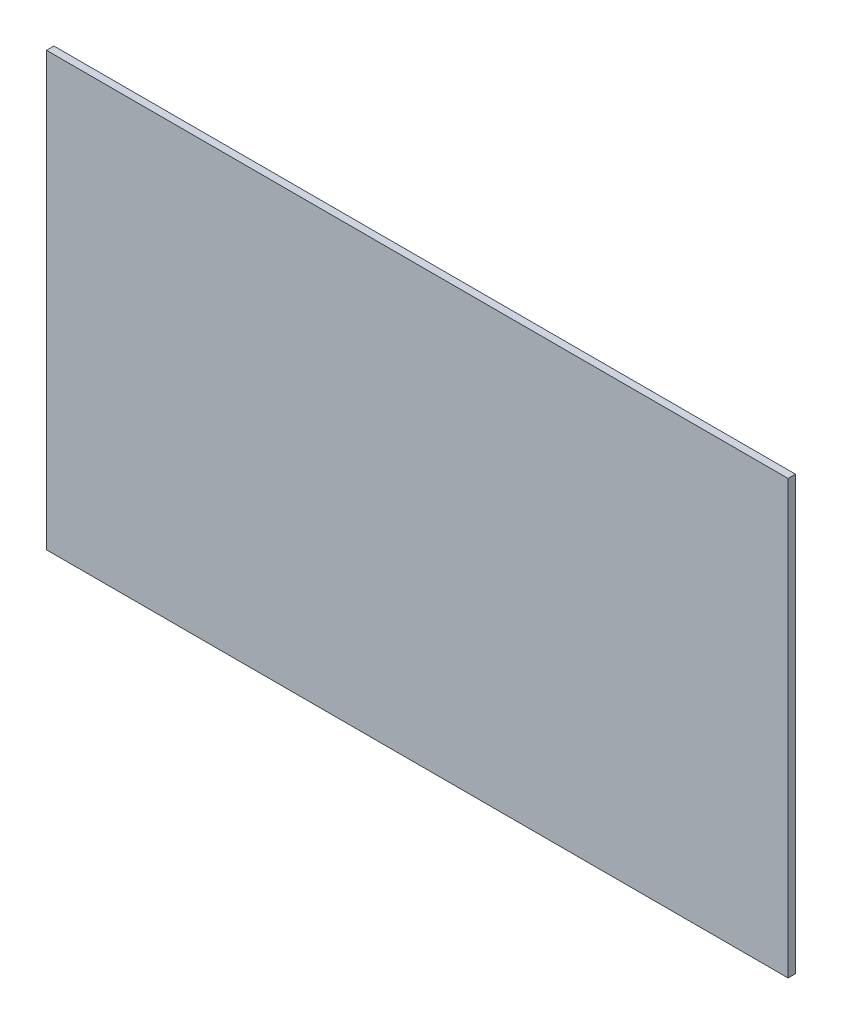
ISO-10303-21;
HEADER;
FILE_DESCRIPTION(('STEP AP214'),'2;1');
FILE_NAME('part.step','',(''),(''),'','','');
FILE_SCHEMA(('AUTOMOTIVE_DESIGN { 1 0 10303 214 1 1 1 1 }'));
ENDSEC;
DATA;
#1=APPLICATION_CONTEXT('core data for automotive mechanical design processes');
#2=APPLICATION_PROTOCOL_DEFINITION('international standard','automotive_design',2000,#1);
#3=PRODUCT_CONTEXT('',#1,'mechanical');
#4=PRODUCT('Part','Part','',(#3));
#5=PRODUCT_RELATED_PRODUCT_CATEGORY('part','',(#4));
#6=PRODUCT_DEFINITION_FORMATION('','',#4);
#7=PRODUCT_DEFINITION_CONTEXT('part definition',#1,'design');
#8=PRODUCT_DEFINITION('design','',#6,#7);
#9=PRODUCT_DEFINITION_SHAPE('','',#8);
#10=(LENGTH_UNIT() NAMED_UNIT(*) SI_UNIT(.MILLI.,.METRE.));
#11=(NAMED_UNIT(*) PLANE_ANGLE_UNIT() SI_UNIT($,.RADIAN.));
#12=(NAMED_UNIT(*) SI_UNIT($,.STERADIAN.) SOLID_ANGLE_UNIT());
#13=UNCERTAINTY_MEASURE_WITH_UNIT(LENGTH_MEASURE(1.E-05),#10,'distance_accuracy_value','');
#14=(GEOMETRIC_REPRESENTATION_CONTEXT(3) GLOBAL_UNCERTAINTY_ASSIGNED_CONTEXT((#13)) GLOBAL_UNIT_ASSIGNED_CONTEXT((#10,
#11,#12)) REPRESENTATION_CONTEXT('',''));
#15=CARTESIAN_POINT('',(0.,0.,0.));
#16=DIRECTION('',(0.,0.,1.));
#17=DIRECTION('',(1.,0.,0.));
#18=AXIS2_PLACEMENT_3D('',#15,#16,#17);
#19=CARTESIAN_POINT('',(0.,0.,0.));
#20=DIRECTION('',(0.,0.,1.));
#21=DIRECTION('',(1.,0.,0.));
#22=AXIS2_PLACEMENT_3D('',#19,#20,#21);
#23=PLANE('',#22);
#24=DIRECTION('',(1.,0.,0.));
#25=VECTOR('',#24,1.);
#26=CARTESIAN_POINT('',(-150.,-87.5,0.));
#27=LINE('',#26,#25);
#28=CARTESIAN_POINT('',(-150.,-87.5,0.));
#29=VERTEX_POINT('',#28);
#30=CARTESIAN_POINT('',(150.,-87.5,0.));
#31=VERTEX_POINT('',#30);
#32=EDGE_CURVE('E25',#29,#31,#27,.T.);
#33=ORIENTED_EDGE('',*,*,#32,.F.);
#34=DIRECTION('',(0.,-1.,0.));
#35=VECTOR('',#34,1.);
#36=CARTESIAN_POINT('',(-150.,87.5,0.));
#37=LINE('',#36,#35);
#38=CARTESIAN_POINT('',(-150.,87.5,0.));
#39=VERTEX_POINT('',#38);
#40=EDGE_CURVE('E75',#39,#29,#37,.T.);
#41=ORIENTED_EDGE('',*,*,#40,.F.);
#42=DIRECTION('',(-1.,0.,0.));
#43=VECTOR('',#42,1.);
#44=CARTESIAN_POINT('',(150.,87.5,0.));
#45=LINE('',#44,#43);
#46=CARTESIAN_POINT('',(150.,87.5,0.));
#47=VERTEX_POINT('',#46);
#48=EDGE_CURVE('E100',#47,#39,#45,.T.);
#49=ORIENTED_EDGE('',*,*,#48,.F.);
#50=DIRECTION('',(0.,1.,0.));
#51=VECTOR('',#50,1.);
#52=CARTESIAN_POINT('',(150.,-87.5,0.));
#53=LINE('',#52,#51);
#54=EDGE_CURVE('E71',#31,#47,#53,.T.);
#55=ORIENTED_EDGE('',*,*,#54,.F.);
#56=EDGE_LOOP('',(#33,#41,#49,#55));
#57=FACE_BOUND('',#56,.T.);
#58=ADVANCED_FACE('F17',(#57),#23,.F.);
#59=CARTESIAN_POINT('',(0.,0.,3.));
#60=DIRECTION('',(0.,0.,1.));
#61=DIRECTION('',(1.,0.,0.));
#62=AXIS2_PLACEMENT_3D('',#59,#60,#61);
#63=PLANE('',#62);
#64=DIRECTION('',(1.,0.,0.));
#65=VECTOR('',#64,1.);
#66=CARTESIAN_POINT('',(-150.,-87.5,3.));
#67=LINE('',#66,#65);
#68=CARTESIAN_POINT('',(-150.,-87.5,3.));
#69=VERTEX_POINT('',#68);
#70=CARTESIAN_POINT('',(150.,-87.5,3.));
#71=VERTEX_POINT('',#70);
#72=EDGE_CURVE('E11',#69,#71,#67,.T.);
#73=ORIENTED_EDGE('',*,*,#72,.T.);
#74=DIRECTION('',(0.,1.,0.));
#75=VECTOR('',#74,1.);
#76=CARTESIAN_POINT('',(150.,-87.5,3.));
#77=LINE('',#76,#75);
#78=CARTESIAN_POINT('',(150.,87.5,3.));
#79=VERTEX_POINT('',#78);
#80=EDGE_CURVE('E108',#71,#79,#77,.T.);
#81=ORIENTED_EDGE('',*,*,#80,.T.);
#82=DIRECTION('',(-1.,0.,0.));
#83=VECTOR('',#82,1.);
#84=CARTESIAN_POINT('',(150.,87.5,3.));
#85=LINE('',#84,#83);
#86=CARTESIAN_POINT('',(-150.,87.5,3.));
#87=VERTEX_POINT('',#86);
#88=EDGE_CURVE('E99',#79,#87,#85,.T.);
#89=ORIENTED_EDGE('',*,*,#88,.T.);
#90=DIRECTION('',(0.,-1.,0.));
#91=VECTOR('',#90,1.);
#92=CARTESIAN_POINT('',(-150.,87.5,3.));
#93=LINE('',#92,#91);
#94=EDGE_CURVE('E81',#87,#69,#93,.T.);
#95=ORIENTED_EDGE('',*,*,#94,.T.);
#96=EDGE_LOOP('',(#73,#81,#89,#95));
#97=FACE_BOUND('',#96,.T.);
#98=ADVANCED_FACE('F120',(#97),#63,.T.);
#99=CARTESIAN_POINT('',(-150.,-87.5,0.));
#100=DIRECTION('',(0.,-1.,0.));
#101=DIRECTION('',(-1.,0.,0.));
#102=AXIS2_PLACEMENT_3D('',#99,#100,#101);
#103=PLANE('',#102);
#104=ORIENTED_EDGE('',*,*,#32,.T.);
#105=DIRECTION('',(0.,0.,1.));
#106=VECTOR('',#105,1.);
#107=CARTESIAN_POINT('',(150.,-87.5,0.));
#108=LINE('',#107,#106);
#109=EDGE_CURVE('E72',#31,#71,#108,.T.);
#110=ORIENTED_EDGE('',*,*,#109,.T.);
#111=ORIENTED_EDGE('',*,*,#72,.F.);
#112=DIRECTION('',(0.,0.,1.));
#113=VECTOR('',#112,1.);
#114=CARTESIAN_POINT('',(-150.,-87.5,0.));
#115=LINE('',#114,#113);
#116=EDGE_CURVE('E76',#29,#69,#115,.T.);
#117=ORIENTED_EDGE('',*,*,#116,.F.);
#118=EDGE_LOOP('',(#104,#110,#111,#117));
#119=FACE_BOUND('',#118,.T.);
#120=ADVANCED_FACE('F80',(#119),#103,.T.);
#121=CARTESIAN_POINT('',(150.,-87.5,0.));
#122=DIRECTION('',(1.,0.,0.));
#123=DIRECTION('',(0.,-1.,0.));
#124=AXIS2_PLACEMENT_3D('',#121,#122,#123);
#125=PLANE('',#124);
#126=ORIENTED_EDGE('',*,*,#54,.T.);
#127=DIRECTION('',(0.,0.,1.));
#128=VECTOR('',#127,1.);
#129=CARTESIAN_POINT('',(150.,87.5,0.));
#130=LINE('',#129,#128);
#131=EDGE_CURVE('E103',#47,#79,#130,.T.);
#132=ORIENTED_EDGE('',*,*,#131,.T.);
#133=ORIENTED_EDGE('',*,*,#80,.F.);
#134=ORIENTED_EDGE('',*,*,#109,.F.);
#135=EDGE_LOOP('',(#126,#132,#133,#134));
#136=FACE_BOUND('',#135,.T.);
#137=ADVANCED_FACE('F117',(#136),#125,.T.);
#138=CARTESIAN_POINT('',(150.,87.5,0.));
#139=DIRECTION('',(0.,1.,0.));
#140=DIRECTION('',(1.,0.,0.));
#141=AXIS2_PLACEMENT_3D('',#138,#139,#140);
#142=PLANE('',#141);
#143=ORIENTED_EDGE('',*,*,#48,.T.);
#144=DIRECTION('',(0.,0.,1.));
#145=VECTOR('',#144,1.);
#146=CARTESIAN_POINT('',(-150.,87.5,0.));
#147=LINE('',#146,#145);
#148=EDGE_CURVE('E88',#39,#87,#147,.T.);
#149=ORIENTED_EDGE('',*,*,#148,.T.);
#150=ORIENTED_EDGE('',*,*,#88,.F.);
#151=ORIENTED_EDGE('',*,*,#131,.F.);
#152=EDGE_LOOP('',(#143,#149,#150,#151));
#153=FACE_BOUND('',#152,.T.);
#154=ADVANCED_FACE('F125',(#153),#142,.T.);
#155=CARTESIAN_POINT('',(-150.,87.5,0.));
#156=DIRECTION('',(-1.,0.,0.));
#157=DIRECTION('',(0.,0.,1.));
#158=AXIS2_PLACEMENT_3D('',#155,#156,#157);
#159=PLANE('',#158);
#160=ORIENTED_EDGE('',*,*,#40,.T.);
#161=ORIENTED_EDGE('',*,*,#116,.T.);
#162=ORIENTED_EDGE('',*,*,#94,.F.);
#163=ORIENTED_EDGE('',*,*,#148,.F.);
#164=EDGE_LOOP('',(#160,#161,#162,#163));
#165=FACE_BOUND('',#164,.T.);
#166=ADVANCED_FACE('F82',(#165),#159,.T.);
#167=CLOSED_SHELL('',(#58,#98,#120,#137,#154,#166));
#168=MANIFOLD_SOLID_BREP('B1',#167);
#169=ADVANCED_BREP_SHAPE_REPRESENTATION('',(#18,#168),#14);
#170=SHAPE_DEFINITION_REPRESENTATION(#9,#169);
ENDSEC;
END-ISO-10303-21;
